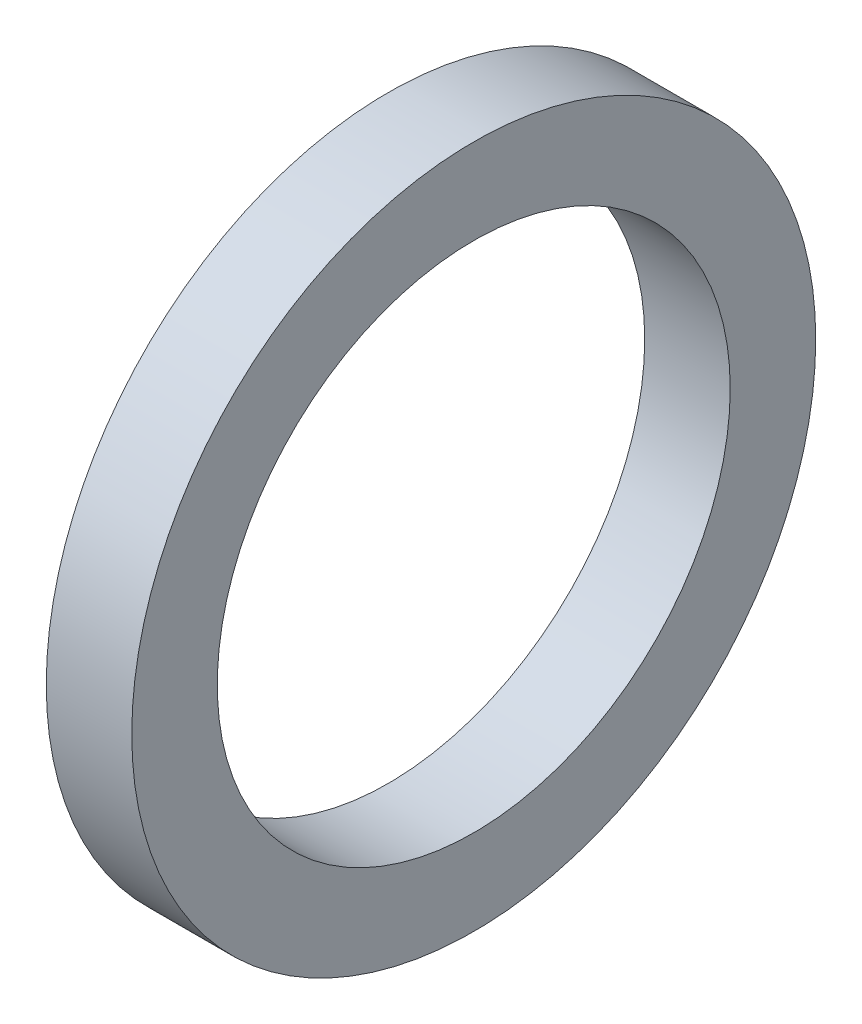
ISO-10303-21;
HEADER;
FILE_DESCRIPTION(('STEP AP214'),'2;1');
FILE_NAME('part.step','',(''),(''),'','','');
FILE_SCHEMA(('AUTOMOTIVE_DESIGN { 1 0 10303 214 1 1 1 1 }'));
ENDSEC;
DATA;
#1=APPLICATION_CONTEXT('core data for automotive mechanical design processes');
#2=APPLICATION_PROTOCOL_DEFINITION('international standard','automotive_design',2000,#1);
#3=PRODUCT_CONTEXT('',#1,'mechanical');
#4=PRODUCT('Part','Part','',(#3));
#5=PRODUCT_RELATED_PRODUCT_CATEGORY('part','',(#4));
#6=PRODUCT_DEFINITION_FORMATION('','',#4);
#7=PRODUCT_DEFINITION_CONTEXT('part definition',#1,'design');
#8=PRODUCT_DEFINITION('design','',#6,#7);
#9=PRODUCT_DEFINITION_SHAPE('','',#8);
#10=(LENGTH_UNIT() NAMED_UNIT(*) SI_UNIT(.MILLI.,.METRE.));
#11=(NAMED_UNIT(*) PLANE_ANGLE_UNIT() SI_UNIT($,.RADIAN.));
#12=(NAMED_UNIT(*) SI_UNIT($,.STERADIAN.) SOLID_ANGLE_UNIT());
#13=UNCERTAINTY_MEASURE_WITH_UNIT(LENGTH_MEASURE(1.E-05),#10,'distance_accuracy_value','');
#14=(GEOMETRIC_REPRESENTATION_CONTEXT(3) GLOBAL_UNCERTAINTY_ASSIGNED_CONTEXT((#13)) GLOBAL_UNIT_ASSIGNED_CONTEXT((#10,
#11,#12)) REPRESENTATION_CONTEXT('',''));
#15=CARTESIAN_POINT('',(0.,0.,0.));
#16=DIRECTION('',(0.,0.,1.));
#17=DIRECTION('',(1.,0.,0.));
#18=AXIS2_PLACEMENT_3D('',#15,#16,#17);
#19=CARTESIAN_POINT('',(1.5875,0.,0.));
#20=DIRECTION('',(1.,0.,0.));
#21=DIRECTION('',(0.,0.,-1.));
#22=AXIS2_PLACEMENT_3D('',#19,#20,#21);
#23=PLANE('',#22);
#24=CARTESIAN_POINT('',(1.5875,0.,0.));
#25=DIRECTION('',(1.,0.,0.));
#26=DIRECTION('',(0.,0.,-1.));
#27=AXIS2_PLACEMENT_3D('',#24,#25,#26);
#28=CIRCLE('',#27,6.35);
#29=CARTESIAN_POINT('',(1.5875,0.,-6.35));
#30=VERTEX_POINT('',#29);
#31=EDGE_CURVE('E10',#30,#30,#28,.T.);
#32=ORIENTED_EDGE('',*,*,#31,.T.);
#33=EDGE_LOOP('',(#32));
#34=FACE_BOUND('',#33,.T.);
#35=CARTESIAN_POINT('',(1.5875,0.,0.));
#36=DIRECTION('',(1.,0.,0.));
#37=DIRECTION('',(0.,0.,-1.));
#38=AXIS2_PLACEMENT_3D('',#35,#36,#37);
#39=CIRCLE('',#38,4.7625);
#40=CARTESIAN_POINT('',(1.5875,0.,-4.7625));
#41=VERTEX_POINT('',#40);
#42=EDGE_CURVE('E42',#41,#41,#39,.T.);
#43=ORIENTED_EDGE('',*,*,#42,.F.);
#44=EDGE_LOOP('',(#43));
#45=FACE_BOUND('',#44,.T.);
#46=ADVANCED_FACE('F31',(#34,#45),#23,.T.);
#47=CARTESIAN_POINT('',(0.,0.,0.));
#48=DIRECTION('',(1.,0.,0.));
#49=DIRECTION('',(0.,0.,-1.));
#50=AXIS2_PLACEMENT_3D('',#47,#48,#49);
#51=PLANE('',#50);
#52=CARTESIAN_POINT('',(0.,0.,0.));
#53=DIRECTION('',(1.,0.,0.));
#54=DIRECTION('',(0.,0.,-1.));
#55=AXIS2_PLACEMENT_3D('',#52,#53,#54);
#56=CIRCLE('',#55,6.35);
#57=CARTESIAN_POINT('',(0.,0.,-6.35));
#58=VERTEX_POINT('',#57);
#59=EDGE_CURVE('E35',#58,#58,#56,.T.);
#60=ORIENTED_EDGE('',*,*,#59,.F.);
#61=EDGE_LOOP('',(#60));
#62=FACE_BOUND('',#61,.T.);
#63=CARTESIAN_POINT('',(0.,0.,0.));
#64=DIRECTION('',(1.,0.,0.));
#65=DIRECTION('',(0.,0.,-1.));
#66=AXIS2_PLACEMENT_3D('',#63,#64,#65);
#67=CIRCLE('',#66,4.7625);
#68=CARTESIAN_POINT('',(0.,0.,-4.7625));
#69=VERTEX_POINT('',#68);
#70=EDGE_CURVE('E44',#69,#69,#67,.T.);
#71=ORIENTED_EDGE('',*,*,#70,.T.);
#72=EDGE_LOOP('',(#71));
#73=FACE_BOUND('',#72,.T.);
#74=ADVANCED_FACE('F54',(#62,#73),#51,.F.);
#75=CARTESIAN_POINT('',(1.5875,0.,0.));
#76=DIRECTION('',(-1.,0.,0.));
#77=DIRECTION('',(0.,0.,1.));
#78=AXIS2_PLACEMENT_3D('',#75,#76,#77);
#79=CYLINDRICAL_SURFACE('',#78,6.35);
#80=ORIENTED_EDGE('',*,*,#31,.F.);
#81=EDGE_LOOP('',(#80));
#82=FACE_BOUND('',#81,.T.);
#83=ORIENTED_EDGE('',*,*,#59,.T.);
#84=EDGE_LOOP('',(#83));
#85=FACE_BOUND('',#84,.T.);
#86=ADVANCED_FACE('F33',(#82,#85),#79,.T.);
#87=CARTESIAN_POINT('',(1.5875,0.,0.));
#88=DIRECTION('',(-1.,0.,0.));
#89=DIRECTION('',(0.,0.,1.));
#90=AXIS2_PLACEMENT_3D('',#87,#88,#89);
#91=CYLINDRICAL_SURFACE('',#90,4.7625);
#92=ORIENTED_EDGE('',*,*,#42,.T.);
#93=EDGE_LOOP('',(#92));
#94=FACE_BOUND('',#93,.T.);
#95=ORIENTED_EDGE('',*,*,#70,.F.);
#96=EDGE_LOOP('',(#95));
#97=FACE_BOUND('',#96,.T.);
#98=ADVANCED_FACE('F50',(#94,#97),#91,.F.);
#99=CLOSED_SHELL('',(#46,#74,#86,#98));
#100=MANIFOLD_SOLID_BREP('B2',#99);
#101=ADVANCED_BREP_SHAPE_REPRESENTATION('',(#18,#100),#14);
#102=SHAPE_DEFINITION_REPRESENTATION(#9,#101);
ENDSEC;
END-ISO-10303-21;
